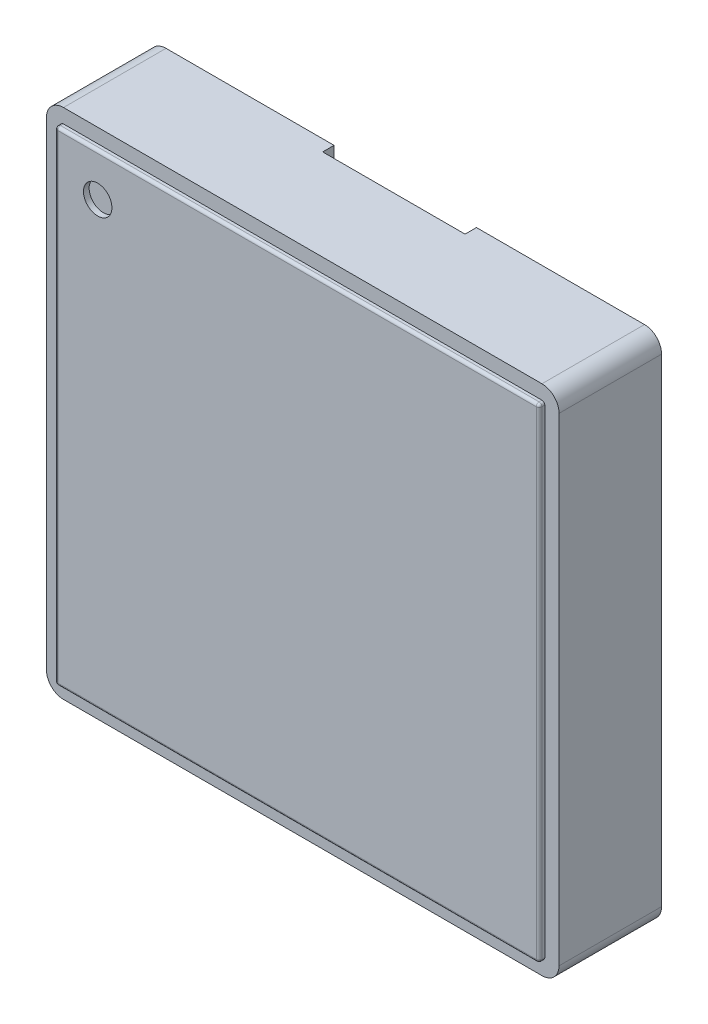
ISO-10303-21;
HEADER;
FILE_DESCRIPTION(('STEP AP214'),'2;1');
FILE_NAME('part.step','',(''),(''),'','','');
FILE_SCHEMA(('AUTOMOTIVE_DESIGN { 1 0 10303 214 1 1 1 1 }'));
ENDSEC;
DATA;
#1=APPLICATION_CONTEXT('core data for automotive mechanical design processes');
#2=APPLICATION_PROTOCOL_DEFINITION('international standard','automotive_design',2000,#1);
#3=PRODUCT_CONTEXT('',#1,'mechanical');
#4=PRODUCT('Part','Part','',(#3));
#5=PRODUCT_RELATED_PRODUCT_CATEGORY('part','',(#4));
#6=PRODUCT_DEFINITION_FORMATION('','',#4);
#7=PRODUCT_DEFINITION_CONTEXT('part definition',#1,'design');
#8=PRODUCT_DEFINITION('design','',#6,#7);
#9=PRODUCT_DEFINITION_SHAPE('','',#8);
#10=(LENGTH_UNIT() NAMED_UNIT(*) SI_UNIT(.MILLI.,.METRE.));
#11=(NAMED_UNIT(*) PLANE_ANGLE_UNIT() SI_UNIT($,.RADIAN.));
#12=(NAMED_UNIT(*) SI_UNIT($,.STERADIAN.) SOLID_ANGLE_UNIT());
#13=UNCERTAINTY_MEASURE_WITH_UNIT(LENGTH_MEASURE(1.E-05),#10,'distance_accuracy_value','');
#14=(GEOMETRIC_REPRESENTATION_CONTEXT(3) GLOBAL_UNCERTAINTY_ASSIGNED_CONTEXT((#13)) GLOBAL_UNIT_ASSIGNED_CONTEXT((#10,
#11,#12)) REPRESENTATION_CONTEXT('',''));
#15=CARTESIAN_POINT('',(0.,0.,0.));
#16=DIRECTION('',(0.,0.,1.));
#17=DIRECTION('',(1.,0.,0.));
#18=AXIS2_PLACEMENT_3D('',#15,#16,#17);
#19=CARTESIAN_POINT('',(-1.25,3.5,0.03));
#20=DIRECTION('',(0.,1.,0.));
#21=DIRECTION('',(0.,0.,1.));
#22=AXIS2_PLACEMENT_3D('',#19,#20,#21);
#23=PLANE('',#22);
#24=DIRECTION('',(0.,0.,1.));
#25=VECTOR('',#24,1.);
#26=CARTESIAN_POINT('',(1.25,3.5,0.03));
#27=LINE('',#26,#25);
#28=CARTESIAN_POINT('',(1.25,3.5,0.03));
#29=VERTEX_POINT('',#28);
#30=CARTESIAN_POINT('',(1.25,3.5,0.23));
#31=VERTEX_POINT('',#30);
#32=EDGE_CURVE('E398',#29,#31,#27,.T.);
#33=ORIENTED_EDGE('',*,*,#32,.F.);
#34=DIRECTION('',(1.,0.,0.));
#35=VECTOR('',#34,1.);
#36=CARTESIAN_POINT('',(0.,3.5,0.03));
#37=LINE('',#36,#35);
#38=CARTESIAN_POINT('',(-1.25,3.5,0.03));
#39=VERTEX_POINT('',#38);
#40=EDGE_CURVE('E388',#29,#39,#37,.F.);
#41=ORIENTED_EDGE('',*,*,#40,.T.);
#42=DIRECTION('',(0.,0.,-1.));
#43=VECTOR('',#42,1.);
#44=CARTESIAN_POINT('',(-1.25,3.5,0.03));
#45=LINE('',#44,#43);
#46=CARTESIAN_POINT('',(-1.25,3.5,0.23));
#47=VERTEX_POINT('',#46);
#48=EDGE_CURVE('E436',#47,#39,#45,.T.);
#49=ORIENTED_EDGE('',*,*,#48,.F.);
#50=DIRECTION('',(1.,0.,0.));
#51=VECTOR('',#50,1.);
#52=CARTESIAN_POINT('',(0.,3.5,0.23));
#53=LINE('',#52,#51);
#54=EDGE_CURVE('E408',#47,#31,#53,.T.);
#55=ORIENTED_EDGE('',*,*,#54,.T.);
#56=EDGE_LOOP('',(#33,#41,#49,#55));
#57=FACE_BOUND('',#56,.T.);
#58=ADVANCED_FACE('F16',(#57),#23,.T.);
#59=CARTESIAN_POINT('',(1.25,-3.5,0.03));
#60=DIRECTION('',(0.,-1.,0.));
#61=DIRECTION('',(0.,0.,-1.));
#62=AXIS2_PLACEMENT_3D('',#59,#60,#61);
#63=PLANE('',#62);
#64=DIRECTION('',(0.,0.,-1.));
#65=VECTOR('',#64,1.);
#66=CARTESIAN_POINT('',(-1.25,-3.5,0.03));
#67=LINE('',#66,#65);
#68=CARTESIAN_POINT('',(-1.25,-3.5,0.03));
#69=VERTEX_POINT('',#68);
#70=CARTESIAN_POINT('',(-1.25,-3.5,0.23));
#71=VERTEX_POINT('',#70);
#72=EDGE_CURVE('E351',#69,#71,#67,.F.);
#73=ORIENTED_EDGE('',*,*,#72,.F.);
#74=DIRECTION('',(1.,0.,0.));
#75=VECTOR('',#74,1.);
#76=CARTESIAN_POINT('',(0.,-3.5,0.03));
#77=LINE('',#76,#75);
#78=CARTESIAN_POINT('',(1.25,-3.5,0.03));
#79=VERTEX_POINT('',#78);
#80=EDGE_CURVE('E339',#69,#79,#77,.T.);
#81=ORIENTED_EDGE('',*,*,#80,.T.);
#82=DIRECTION('',(0.,0.,1.));
#83=VECTOR('',#82,1.);
#84=CARTESIAN_POINT('',(1.25,-3.5,0.03));
#85=LINE('',#84,#83);
#86=CARTESIAN_POINT('',(1.25,-3.5,0.23));
#87=VERTEX_POINT('',#86);
#88=EDGE_CURVE('E362',#87,#79,#85,.F.);
#89=ORIENTED_EDGE('',*,*,#88,.F.);
#90=DIRECTION('',(1.,0.,0.));
#91=VECTOR('',#90,1.);
#92=CARTESIAN_POINT('',(0.,-3.5,0.23));
#93=LINE('',#92,#91);
#94=EDGE_CURVE('E361',#87,#71,#93,.F.);
#95=ORIENTED_EDGE('',*,*,#94,.T.);
#96=EDGE_LOOP('',(#73,#81,#89,#95));
#97=FACE_BOUND('',#96,.T.);
#98=ADVANCED_FACE('F578',(#97),#63,.T.);
#99=CARTESIAN_POINT('',(-1.25,4.5,0.03));
#100=DIRECTION('',(1.,0.,0.));
#101=DIRECTION('',(0.,0.,-1.));
#102=AXIS2_PLACEMENT_3D('',#99,#100,#101);
#103=PLANE('',#102);
#104=ORIENTED_EDGE('',*,*,#48,.T.);
#105=DIRECTION('',(0.,1.,0.));
#106=VECTOR('',#105,1.);
#107=CARTESIAN_POINT('',(-1.25,0.,0.03));
#108=LINE('',#107,#106);
#109=CARTESIAN_POINT('',(-1.25,4.5,0.03));
#110=VERTEX_POINT('',#109);
#111=EDGE_CURVE('E418',#39,#110,#108,.T.);
#112=ORIENTED_EDGE('',*,*,#111,.T.);
#113=DIRECTION('',(0.,0.,-1.));
#114=VECTOR('',#113,1.);
#115=CARTESIAN_POINT('',(-1.25,4.5,0.03));
#116=LINE('',#115,#114);
#117=CARTESIAN_POINT('',(-1.25,4.5,0.23));
#118=VERTEX_POINT('',#117);
#119=EDGE_CURVE('E402',#110,#118,#116,.F.);
#120=ORIENTED_EDGE('',*,*,#119,.T.);
#121=DIRECTION('',(0.,1.,0.));
#122=VECTOR('',#121,1.);
#123=CARTESIAN_POINT('',(-1.25,4.,0.23));
#124=LINE('',#123,#122);
#125=EDGE_CURVE('E405',#118,#47,#124,.F.);
#126=ORIENTED_EDGE('',*,*,#125,.T.);
#127=EDGE_LOOP('',(#104,#112,#120,#126));
#128=FACE_BOUND('',#127,.T.);
#129=ADVANCED_FACE('F575',(#128),#103,.T.);
#130=CARTESIAN_POINT('',(0.,4.,0.23));
#131=DIRECTION('',(0.,0.,1.));
#132=DIRECTION('',(1.,0.,0.));
#133=AXIS2_PLACEMENT_3D('',#130,#131,#132);
#134=PLANE('',#133);
#135=DIRECTION('',(1.,0.,0.));
#136=VECTOR('',#135,1.);
#137=CARTESIAN_POINT('',(4.5,4.5,0.23));
#138=LINE('',#137,#136);
#139=CARTESIAN_POINT('',(1.25,4.5,0.23));
#140=VERTEX_POINT('',#139);
#141=EDGE_CURVE('E393',#118,#140,#138,.T.);
#142=ORIENTED_EDGE('',*,*,#141,.T.);
#143=DIRECTION('',(0.,1.,0.));
#144=VECTOR('',#143,1.);
#145=CARTESIAN_POINT('',(1.25,3.5,0.23));
#146=LINE('',#145,#144);
#147=EDGE_CURVE('E198',#31,#140,#146,.T.);
#148=ORIENTED_EDGE('',*,*,#147,.F.);
#149=ORIENTED_EDGE('',*,*,#54,.F.);
#150=ORIENTED_EDGE('',*,*,#125,.F.);
#151=EDGE_LOOP('',(#142,#148,#149,#150));
#152=FACE_BOUND('',#151,.T.);
#153=ADVANCED_FACE('F571',(#152),#134,.F.);
#154=CARTESIAN_POINT('',(1.25,3.5,0.03));
#155=DIRECTION('',(-1.,0.,0.));
#156=DIRECTION('',(0.,0.,1.));
#157=AXIS2_PLACEMENT_3D('',#154,#155,#156);
#158=PLANE('',#157);
#159=DIRECTION('',(0.,0.,-1.));
#160=VECTOR('',#159,1.);
#161=CARTESIAN_POINT('',(1.25,4.5,0.03));
#162=LINE('',#161,#160);
#163=CARTESIAN_POINT('',(1.25,4.5,0.03));
#164=VERTEX_POINT('',#163);
#165=EDGE_CURVE('E382',#140,#164,#162,.T.);
#166=ORIENTED_EDGE('',*,*,#165,.T.);
#167=DIRECTION('',(0.,1.,0.));
#168=VECTOR('',#167,1.);
#169=CARTESIAN_POINT('',(1.25,0.,0.03));
#170=LINE('',#169,#168);
#171=EDGE_CURVE('E385',#164,#29,#170,.F.);
#172=ORIENTED_EDGE('',*,*,#171,.T.);
#173=ORIENTED_EDGE('',*,*,#32,.T.);
#174=ORIENTED_EDGE('',*,*,#147,.T.);
#175=EDGE_LOOP('',(#166,#172,#173,#174));
#176=FACE_BOUND('',#175,.T.);
#177=ADVANCED_FACE('F568',(#176),#158,.T.);
#178=CARTESIAN_POINT('',(4.2,4.2,0.03));
#179=DIRECTION('',(0.,0.,1.));
#180=DIRECTION('',(1.,0.,0.));
#181=AXIS2_PLACEMENT_3D('',#178,#179,#180);
#182=CYLINDRICAL_SURFACE('',#181,0.3);
#183=CARTESIAN_POINT('',(4.2,4.2,1.83));
#184=DIRECTION('',(0.,0.,1.));
#185=DIRECTION('',(1.,0.,0.));
#186=AXIS2_PLACEMENT_3D('',#183,#184,#185);
#187=CIRCLE('',#186,0.3);
#188=CARTESIAN_POINT('',(4.2,4.5,1.83));
#189=VERTEX_POINT('',#188);
#190=CARTESIAN_POINT('',(4.5,4.2,1.83));
#191=VERTEX_POINT('',#190);
#192=EDGE_CURVE('E19',#189,#191,#187,.F.);
#193=ORIENTED_EDGE('',*,*,#192,.T.);
#194=DIRECTION('',(0.,0.,1.));
#195=VECTOR('',#194,1.);
#196=CARTESIAN_POINT('',(4.5,4.2,0.03));
#197=LINE('',#196,#195);
#198=CARTESIAN_POINT('',(4.5,4.2,0.03));
#199=VERTEX_POINT('',#198);
#200=EDGE_CURVE('E192',#191,#199,#197,.F.);
#201=ORIENTED_EDGE('',*,*,#200,.T.);
#202=CARTESIAN_POINT('',(4.2,4.2,0.03));
#203=DIRECTION('',(0.,0.,1.));
#204=DIRECTION('',(1.,0.,0.));
#205=AXIS2_PLACEMENT_3D('',#202,#203,#204);
#206=CIRCLE('',#205,0.3);
#207=CARTESIAN_POINT('',(4.2,4.5,0.03));
#208=VERTEX_POINT('',#207);
#209=EDGE_CURVE('E389',#199,#208,#206,.T.);
#210=ORIENTED_EDGE('',*,*,#209,.T.);
#211=DIRECTION('',(0.,0.,-1.));
#212=VECTOR('',#211,1.);
#213=CARTESIAN_POINT('',(4.2,4.5,0.03));
#214=LINE('',#213,#212);
#215=EDGE_CURVE('E195',#208,#189,#214,.F.);
#216=ORIENTED_EDGE('',*,*,#215,.T.);
#217=EDGE_LOOP('',(#193,#201,#210,#216));
#218=FACE_BOUND('',#217,.T.);
#219=ADVANCED_FACE('F191',(#218),#182,.T.);
#220=CARTESIAN_POINT('',(-4.2,4.2,0.03));
#221=DIRECTION('',(0.,0.,1.));
#222=DIRECTION('',(1.,0.,0.));
#223=AXIS2_PLACEMENT_3D('',#220,#221,#222);
#224=CYLINDRICAL_SURFACE('',#223,0.3);
#225=DIRECTION('',(0.,0.,-1.));
#226=VECTOR('',#225,1.);
#227=CARTESIAN_POINT('',(-4.2,4.5,0.03));
#228=LINE('',#227,#226);
#229=CARTESIAN_POINT('',(-4.2,4.5,1.83));
#230=VERTEX_POINT('',#229);
#231=CARTESIAN_POINT('',(-4.2,4.5,0.03));
#232=VERTEX_POINT('',#231);
#233=EDGE_CURVE('E327',#230,#232,#228,.T.);
#234=ORIENTED_EDGE('',*,*,#233,.T.);
#235=CARTESIAN_POINT('',(-4.2,4.2,0.03));
#236=DIRECTION('',(0.,0.,1.));
#237=DIRECTION('',(1.,0.,0.));
#238=AXIS2_PLACEMENT_3D('',#235,#236,#237);
#239=CIRCLE('',#238,0.3);
#240=CARTESIAN_POINT('',(-4.5,4.2,0.03));
#241=VERTEX_POINT('',#240);
#242=EDGE_CURVE('E340',#232,#241,#239,.T.);
#243=ORIENTED_EDGE('',*,*,#242,.T.);
#244=DIRECTION('',(0.,0.,-1.));
#245=VECTOR('',#244,1.);
#246=CARTESIAN_POINT('',(-4.5,4.2,0.03));
#247=LINE('',#246,#245);
#248=CARTESIAN_POINT('',(-4.5,4.2,1.83));
#249=VERTEX_POINT('',#248);
#250=EDGE_CURVE('E319',#241,#249,#247,.F.);
#251=ORIENTED_EDGE('',*,*,#250,.T.);
#252=CARTESIAN_POINT('',(-4.2,4.2,1.83));
#253=DIRECTION('',(0.,0.,1.));
#254=DIRECTION('',(1.,0.,0.));
#255=AXIS2_PLACEMENT_3D('',#252,#253,#254);
#256=CIRCLE('',#255,0.3);
#257=EDGE_CURVE('E197',#249,#230,#256,.F.);
#258=ORIENTED_EDGE('',*,*,#257,.T.);
#259=EDGE_LOOP('',(#234,#243,#251,#258));
#260=FACE_BOUND('',#259,.T.);
#261=ADVANCED_FACE('F474',(#260),#224,.T.);
#262=CARTESIAN_POINT('',(4.2,-4.2,0.03));
#263=DIRECTION('',(0.,0.,1.));
#264=DIRECTION('',(1.,0.,0.));
#265=AXIS2_PLACEMENT_3D('',#262,#263,#264);
#266=CYLINDRICAL_SURFACE('',#265,0.3);
#267=CARTESIAN_POINT('',(4.2,-4.2,1.83));
#268=DIRECTION('',(0.,0.,1.));
#269=DIRECTION('',(1.,0.,0.));
#270=AXIS2_PLACEMENT_3D('',#267,#268,#269);
#271=CIRCLE('',#270,0.3);
#272=CARTESIAN_POINT('',(4.5,-4.2,1.83));
#273=VERTEX_POINT('',#272);
#274=CARTESIAN_POINT('',(4.2,-4.5,1.83));
#275=VERTEX_POINT('',#274);
#276=EDGE_CURVE('E211',#273,#275,#271,.F.);
#277=ORIENTED_EDGE('',*,*,#276,.T.);
#278=DIRECTION('',(0.,0.,1.));
#279=VECTOR('',#278,1.);
#280=CARTESIAN_POINT('',(4.2,-4.5,0.03));
#281=LINE('',#280,#279);
#282=CARTESIAN_POINT('',(4.2,-4.5,0.03));
#283=VERTEX_POINT('',#282);
#284=EDGE_CURVE('E315',#275,#283,#281,.F.);
#285=ORIENTED_EDGE('',*,*,#284,.T.);
#286=CARTESIAN_POINT('',(4.2,-4.2,0.03));
#287=DIRECTION('',(0.,0.,1.));
#288=DIRECTION('',(1.,0.,0.));
#289=AXIS2_PLACEMENT_3D('',#286,#287,#288);
#290=CIRCLE('',#289,0.3);
#291=CARTESIAN_POINT('',(4.5,-4.2,0.03));
#292=VERTEX_POINT('',#291);
#293=EDGE_CURVE('E350',#283,#292,#290,.T.);
#294=ORIENTED_EDGE('',*,*,#293,.T.);
#295=DIRECTION('',(0.,0.,1.));
#296=VECTOR('',#295,1.);
#297=CARTESIAN_POINT('',(4.5,-4.2,0.03));
#298=LINE('',#297,#296);
#299=EDGE_CURVE('E206',#292,#273,#298,.T.);
#300=ORIENTED_EDGE('',*,*,#299,.T.);
#301=EDGE_LOOP('',(#277,#285,#294,#300));
#302=FACE_BOUND('',#301,.T.);
#303=ADVANCED_FACE('F559',(#302),#266,.T.);
#304=CARTESIAN_POINT('',(1.25,-4.5,0.03));
#305=DIRECTION('',(-1.,0.,0.));
#306=DIRECTION('',(0.,0.,1.));
#307=AXIS2_PLACEMENT_3D('',#304,#305,#306);
#308=PLANE('',#307);
#309=ORIENTED_EDGE('',*,*,#88,.T.);
#310=DIRECTION('',(0.,1.,0.));
#311=VECTOR('',#310,1.);
#312=CARTESIAN_POINT('',(1.25,0.,0.03));
#313=LINE('',#312,#311);
#314=CARTESIAN_POINT('',(1.25,-4.5,0.03));
#315=VERTEX_POINT('',#314);
#316=EDGE_CURVE('E372',#79,#315,#313,.F.);
#317=ORIENTED_EDGE('',*,*,#316,.T.);
#318=DIRECTION('',(0.,0.,1.));
#319=VECTOR('',#318,1.);
#320=CARTESIAN_POINT('',(1.25,-4.5,0.03));
#321=LINE('',#320,#319);
#322=CARTESIAN_POINT('',(1.25,-4.5,0.23));
#323=VERTEX_POINT('',#322);
#324=EDGE_CURVE('E355',#315,#323,#321,.T.);
#325=ORIENTED_EDGE('',*,*,#324,.T.);
#326=DIRECTION('',(0.,1.,0.));
#327=VECTOR('',#326,1.);
#328=CARTESIAN_POINT('',(1.25,-4.,0.23));
#329=LINE('',#328,#327);
#330=EDGE_CURVE('E358',#323,#87,#329,.T.);
#331=ORIENTED_EDGE('',*,*,#330,.T.);
#332=EDGE_LOOP('',(#309,#317,#325,#331));
#333=FACE_BOUND('',#332,.T.);
#334=ADVANCED_FACE('F555',(#333),#308,.T.);
#335=CARTESIAN_POINT('',(0.,-4.,0.23));
#336=DIRECTION('',(0.,0.,1.));
#337=DIRECTION('',(1.,0.,0.));
#338=AXIS2_PLACEMENT_3D('',#335,#336,#337);
#339=PLANE('',#338);
#340=ORIENTED_EDGE('',*,*,#94,.F.);
#341=ORIENTED_EDGE('',*,*,#330,.F.);
#342=DIRECTION('',(1.,0.,0.));
#343=VECTOR('',#342,1.);
#344=CARTESIAN_POINT('',(-4.5,-4.5,0.23));
#345=LINE('',#344,#343);
#346=CARTESIAN_POINT('',(-1.25,-4.5,0.23));
#347=VERTEX_POINT('',#346);
#348=EDGE_CURVE('E344',#323,#347,#345,.F.);
#349=ORIENTED_EDGE('',*,*,#348,.T.);
#350=DIRECTION('',(0.,1.,0.));
#351=VECTOR('',#350,1.);
#352=CARTESIAN_POINT('',(-1.25,-3.5,0.23));
#353=LINE('',#352,#351);
#354=EDGE_CURVE('E347',#71,#347,#353,.F.);
#355=ORIENTED_EDGE('',*,*,#354,.F.);
#356=EDGE_LOOP('',(#340,#341,#349,#355));
#357=FACE_BOUND('',#356,.T.);
#358=ADVANCED_FACE('F551',(#357),#339,.F.);
#359=CARTESIAN_POINT('',(-1.25,-3.5,0.03));
#360=DIRECTION('',(1.,0.,0.));
#361=DIRECTION('',(0.,0.,-1.));
#362=AXIS2_PLACEMENT_3D('',#359,#360,#361);
#363=PLANE('',#362);
#364=DIRECTION('',(0.,0.,1.));
#365=VECTOR('',#364,1.);
#366=CARTESIAN_POINT('',(-1.25,-4.5,0.03));
#367=LINE('',#366,#365);
#368=CARTESIAN_POINT('',(-1.25,-4.5,0.03));
#369=VERTEX_POINT('',#368);
#370=EDGE_CURVE('E333',#347,#369,#367,.F.);
#371=ORIENTED_EDGE('',*,*,#370,.T.);
#372=DIRECTION('',(0.,1.,0.));
#373=VECTOR('',#372,1.);
#374=CARTESIAN_POINT('',(-1.25,0.,0.03));
#375=LINE('',#374,#373);
#376=EDGE_CURVE('E336',#369,#69,#375,.T.);
#377=ORIENTED_EDGE('',*,*,#376,.T.);
#378=ORIENTED_EDGE('',*,*,#72,.T.);
#379=ORIENTED_EDGE('',*,*,#354,.T.);
#380=EDGE_LOOP('',(#371,#377,#378,#379));
#381=FACE_BOUND('',#380,.T.);
#382=ADVANCED_FACE('F548',(#381),#363,.T.);
#383=CARTESIAN_POINT('',(0.,0.,0.03));
#384=DIRECTION('',(0.,0.,1.));
#385=DIRECTION('',(1.,0.,0.));
#386=AXIS2_PLACEMENT_3D('',#383,#384,#385);
#387=PLANE('',#386);
#388=ORIENTED_EDGE('',*,*,#316,.F.);
#389=ORIENTED_EDGE('',*,*,#80,.F.);
#390=ORIENTED_EDGE('',*,*,#376,.F.);
#391=DIRECTION('',(1.,0.,0.));
#392=VECTOR('',#391,1.);
#393=CARTESIAN_POINT('',(-4.5,-4.5,0.03));
#394=LINE('',#393,#392);
#395=CARTESIAN_POINT('',(-4.2,-4.5,0.03));
#396=VERTEX_POINT('',#395);
#397=EDGE_CURVE('E314',#369,#396,#394,.F.);
#398=ORIENTED_EDGE('',*,*,#397,.T.);
#399=CARTESIAN_POINT('',(-4.2,-4.2,0.03));
#400=DIRECTION('',(0.,0.,1.));
#401=DIRECTION('',(1.,0.,0.));
#402=AXIS2_PLACEMENT_3D('',#399,#400,#401);
#403=CIRCLE('',#402,0.3);
#404=CARTESIAN_POINT('',(-4.5,-4.2,0.03));
#405=VERTEX_POINT('',#404);
#406=EDGE_CURVE('E330',#405,#396,#403,.T.);
#407=ORIENTED_EDGE('',*,*,#406,.F.);
#408=DIRECTION('',(0.,1.,0.));
#409=VECTOR('',#408,1.);
#410=CARTESIAN_POINT('',(-4.5,4.5,0.03));
#411=LINE('',#410,#409);
#412=EDGE_CURVE('E318',#405,#241,#411,.T.);
#413=ORIENTED_EDGE('',*,*,#412,.T.);
#414=ORIENTED_EDGE('',*,*,#242,.F.);
#415=DIRECTION('',(1.,0.,0.));
#416=VECTOR('',#415,1.);
#417=CARTESIAN_POINT('',(4.5,4.5,0.03));
#418=LINE('',#417,#416);
#419=EDGE_CURVE('E329',#232,#110,#418,.T.);
#420=ORIENTED_EDGE('',*,*,#419,.T.);
#421=ORIENTED_EDGE('',*,*,#111,.F.);
#422=ORIENTED_EDGE('',*,*,#40,.F.);
#423=ORIENTED_EDGE('',*,*,#171,.F.);
#424=DIRECTION('',(1.,0.,0.));
#425=VECTOR('',#424,1.);
#426=CARTESIAN_POINT('',(4.5,4.5,0.03));
#427=LINE('',#426,#425);
#428=EDGE_CURVE('E326',#164,#208,#427,.T.);
#429=ORIENTED_EDGE('',*,*,#428,.T.);
#430=ORIENTED_EDGE('',*,*,#209,.F.);
#431=DIRECTION('',(0.,1.,0.));
#432=VECTOR('',#431,1.);
#433=CARTESIAN_POINT('',(4.5,-4.5,0.03));
#434=LINE('',#433,#432);
#435=EDGE_CURVE('E205',#199,#292,#434,.F.);
#436=ORIENTED_EDGE('',*,*,#435,.T.);
#437=ORIENTED_EDGE('',*,*,#293,.F.);
#438=DIRECTION('',(1.,0.,0.));
#439=VECTOR('',#438,1.);
#440=CARTESIAN_POINT('',(-4.5,-4.5,0.03));
#441=LINE('',#440,#439);
#442=EDGE_CURVE('E317',#283,#315,#441,.F.);
#443=ORIENTED_EDGE('',*,*,#442,.T.);
#444=EDGE_LOOP('',(#388,#389,#390,#398,#407,#413,#414,#420,#421,#422,#423,#429,#430,#436,#437,#443));
#445=FACE_BOUND('',#444,.T.);
#446=ADVANCED_FACE('F488',(#445),#387,.F.);
#447=CARTESIAN_POINT('',(-4.2,-4.2,0.03));
#448=DIRECTION('',(0.,0.,1.));
#449=DIRECTION('',(1.,0.,0.));
#450=AXIS2_PLACEMENT_3D('',#447,#448,#449);
#451=CYLINDRICAL_SURFACE('',#450,0.3);
#452=DIRECTION('',(0.,0.,-1.));
#453=VECTOR('',#452,1.);
#454=CARTESIAN_POINT('',(-4.5,-4.2,0.03));
#455=LINE('',#454,#453);
#456=CARTESIAN_POINT('',(-4.5,-4.2,1.83));
#457=VERTEX_POINT('',#456);
#458=EDGE_CURVE('E322',#457,#405,#455,.T.);
#459=ORIENTED_EDGE('',*,*,#458,.T.);
#460=ORIENTED_EDGE('',*,*,#406,.T.);
#461=DIRECTION('',(0.,0.,1.));
#462=VECTOR('',#461,1.);
#463=CARTESIAN_POINT('',(-4.2,-4.5,0.03));
#464=LINE('',#463,#462);
#465=CARTESIAN_POINT('',(-4.2,-4.5,1.83));
#466=VERTEX_POINT('',#465);
#467=EDGE_CURVE('E311',#396,#466,#464,.T.);
#468=ORIENTED_EDGE('',*,*,#467,.T.);
#469=CARTESIAN_POINT('',(-4.2,-4.2,1.83));
#470=DIRECTION('',(0.,0.,1.));
#471=DIRECTION('',(1.,0.,0.));
#472=AXIS2_PLACEMENT_3D('',#469,#470,#471);
#473=CIRCLE('',#472,0.3);
#474=EDGE_CURVE('E374',#466,#457,#473,.F.);
#475=ORIENTED_EDGE('',*,*,#474,.T.);
#476=EDGE_LOOP('',(#459,#460,#468,#475));
#477=FACE_BOUND('',#476,.T.);
#478=ADVANCED_FACE('F542',(#477),#451,.T.);
#479=CARTESIAN_POINT('',(4.5,-4.5,0.03));
#480=DIRECTION('',(-1.,0.,0.));
#481=DIRECTION('',(0.,0.,1.));
#482=AXIS2_PLACEMENT_3D('',#479,#480,#481);
#483=PLANE('',#482);
#484=ORIENTED_EDGE('',*,*,#299,.F.);
#485=ORIENTED_EDGE('',*,*,#435,.F.);
#486=ORIENTED_EDGE('',*,*,#200,.F.);
#487=DIRECTION('',(0.,1.,0.));
#488=VECTOR('',#487,1.);
#489=CARTESIAN_POINT('',(4.5,0.,1.83));
#490=LINE('',#489,#488);
#491=EDGE_CURVE('E204',#273,#191,#490,.T.);
#492=ORIENTED_EDGE('',*,*,#491,.F.);
#493=EDGE_LOOP('',(#484,#485,#486,#492));
#494=FACE_BOUND('',#493,.T.);
#495=ADVANCED_FACE('F203',(#494),#483,.F.);
#496=CARTESIAN_POINT('',(4.5,4.5,0.03));
#497=DIRECTION('',(0.,-1.,0.));
#498=DIRECTION('',(0.,0.,-1.));
#499=AXIS2_PLACEMENT_3D('',#496,#497,#498);
#500=PLANE('',#499);
#501=ORIENTED_EDGE('',*,*,#428,.F.);
#502=ORIENTED_EDGE('',*,*,#165,.F.);
#503=ORIENTED_EDGE('',*,*,#141,.F.);
#504=ORIENTED_EDGE('',*,*,#119,.F.);
#505=ORIENTED_EDGE('',*,*,#419,.F.);
#506=ORIENTED_EDGE('',*,*,#233,.F.);
#507=DIRECTION('',(1.,0.,0.));
#508=VECTOR('',#507,1.);
#509=CARTESIAN_POINT('',(0.,4.5,1.83));
#510=LINE('',#509,#508);
#511=EDGE_CURVE('E213',#189,#230,#510,.F.);
#512=ORIENTED_EDGE('',*,*,#511,.F.);
#513=ORIENTED_EDGE('',*,*,#215,.F.);
#514=EDGE_LOOP('',(#501,#502,#503,#504,#505,#506,#512,#513));
#515=FACE_BOUND('',#514,.T.);
#516=ADVANCED_FACE('F482',(#515),#500,.F.);
#517=CARTESIAN_POINT('',(-4.5,4.5,0.03));
#518=DIRECTION('',(1.,0.,0.));
#519=DIRECTION('',(0.,0.,-1.));
#520=AXIS2_PLACEMENT_3D('',#517,#518,#519);
#521=PLANE('',#520);
#522=ORIENTED_EDGE('',*,*,#250,.F.);
#523=ORIENTED_EDGE('',*,*,#412,.F.);
#524=ORIENTED_EDGE('',*,*,#458,.F.);
#525=DIRECTION('',(0.,1.,0.));
#526=VECTOR('',#525,1.);
#527=CARTESIAN_POINT('',(-4.5,0.,1.83));
#528=LINE('',#527,#526);
#529=EDGE_CURVE('E216',#249,#457,#528,.F.);
#530=ORIENTED_EDGE('',*,*,#529,.F.);
#531=EDGE_LOOP('',(#522,#523,#524,#530));
#532=FACE_BOUND('',#531,.T.);
#533=ADVANCED_FACE('F492',(#532),#521,.F.);
#534=CARTESIAN_POINT('',(-4.5,-4.5,0.03));
#535=DIRECTION('',(0.,1.,0.));
#536=DIRECTION('',(0.,0.,1.));
#537=AXIS2_PLACEMENT_3D('',#534,#535,#536);
#538=PLANE('',#537);
#539=ORIENTED_EDGE('',*,*,#397,.F.);
#540=ORIENTED_EDGE('',*,*,#370,.F.);
#541=ORIENTED_EDGE('',*,*,#348,.F.);
#542=ORIENTED_EDGE('',*,*,#324,.F.);
#543=ORIENTED_EDGE('',*,*,#442,.F.);
#544=ORIENTED_EDGE('',*,*,#284,.F.);
#545=DIRECTION('',(1.,0.,0.));
#546=VECTOR('',#545,1.);
#547=CARTESIAN_POINT('',(0.,-4.5,1.83));
#548=LINE('',#547,#546);
#549=EDGE_CURVE('E461',#466,#275,#548,.T.);
#550=ORIENTED_EDGE('',*,*,#549,.F.);
#551=ORIENTED_EDGE('',*,*,#467,.F.);
#552=EDGE_LOOP('',(#539,#540,#541,#542,#543,#544,#550,#551));
#553=FACE_BOUND('',#552,.T.);
#554=ADVANCED_FACE('F531',(#553),#538,.F.);
#555=CARTESIAN_POINT('',(4.2,-4.2,1.83));
#556=DIRECTION('',(0.,0.,1.));
#557=DIRECTION('',(1.,0.,0.));
#558=AXIS2_PLACEMENT_3D('',#555,#556,#557);
#559=CYLINDRICAL_SURFACE('',#558,0.05);
#560=CARTESIAN_POINT('',(4.2,-4.2,1.88));
#561=DIRECTION('',(-1.53321187377335E-11,0.,1.));
#562=DIRECTION('',(0.,-1.,0.));
#563=AXIS2_PLACEMENT_3D('',#560,#561,#562);
#564=CIRCLE('',#563,0.05);
#565=CARTESIAN_POINT('',(4.2,-4.25,1.88));
#566=VERTEX_POINT('',#565);
#567=CARTESIAN_POINT('',(4.25,-4.2,1.88000000000019));
#568=VERTEX_POINT('',#567);
#569=EDGE_CURVE('E280',#566,#568,#564,.T.);
#570=ORIENTED_EDGE('',*,*,#569,.F.);
#571=DIRECTION('',(0.,0.,-1.));
#572=VECTOR('',#571,1.);
#573=CARTESIAN_POINT('',(4.2,-4.25,1.83));
#574=LINE('',#573,#572);
#575=CARTESIAN_POINT('',(4.2,-4.25,1.83));
#576=VERTEX_POINT('',#575);
#577=EDGE_CURVE('E292',#576,#566,#574,.F.);
#578=ORIENTED_EDGE('',*,*,#577,.F.);
#579=CARTESIAN_POINT('',(4.2,-4.2,1.83));
#580=DIRECTION('',(0.,0.,1.));
#581=DIRECTION('',(1.,0.,0.));
#582=AXIS2_PLACEMENT_3D('',#579,#580,#581);
#583=CIRCLE('',#582,0.05);
#584=CARTESIAN_POINT('',(4.25,-4.2,1.83));
#585=VERTEX_POINT('',#584);
#586=EDGE_CURVE('E214',#585,#576,#583,.F.);
#587=ORIENTED_EDGE('',*,*,#586,.F.);
#588=DIRECTION('',(0.,0.,-1.));
#589=VECTOR('',#588,1.);
#590=CARTESIAN_POINT('',(4.25,-4.2,1.83));
#591=LINE('',#590,#589);
#592=EDGE_CURVE('E246',#568,#585,#591,.T.);
#593=ORIENTED_EDGE('',*,*,#592,.F.);
#594=EDGE_LOOP('',(#570,#578,#587,#593));
#595=FACE_BOUND('',#594,.T.);
#596=ADVANCED_FACE('F527',(#595),#559,.T.);
#597=CARTESIAN_POINT('',(4.2,4.2,1.88));
#598=DIRECTION('',(0.,0.,-1.));
#599=DIRECTION('',(-1.,0.,0.));
#600=AXIS2_PLACEMENT_3D('',#597,#598,#599);
#601=CYLINDRICAL_SURFACE('',#600,0.05);
#602=CARTESIAN_POINT('',(4.2,4.2,1.83));
#603=DIRECTION('',(0.,0.,-1.));
#604=DIRECTION('',(-1.,0.,0.));
#605=AXIS2_PLACEMENT_3D('',#602,#603,#604);
#606=CIRCLE('',#605,0.05);
#607=CARTESIAN_POINT('',(4.2,4.25,1.83));
#608=VERTEX_POINT('',#607);
#609=CARTESIAN_POINT('',(4.25,4.2,1.83));
#610=VERTEX_POINT('',#609);
#611=EDGE_CURVE('E218',#608,#610,#606,.T.);
#612=ORIENTED_EDGE('',*,*,#611,.F.);
#613=DIRECTION('',(0.,0.,1.));
#614=VECTOR('',#613,1.);
#615=CARTESIAN_POINT('',(4.2,4.25,1.83));
#616=LINE('',#615,#614);
#617=CARTESIAN_POINT('',(4.2,4.25,1.88));
#618=VERTEX_POINT('',#617);
#619=EDGE_CURVE('E233',#618,#608,#616,.F.);
#620=ORIENTED_EDGE('',*,*,#619,.F.);
#621=CARTESIAN_POINT('',(4.2,4.2,1.88));
#622=DIRECTION('',(0.,0.,1.));
#623=DIRECTION('',(0.,-1.,0.));
#624=AXIS2_PLACEMENT_3D('',#621,#622,#623);
#625=CIRCLE('',#624,0.0499999999999997);
#626=CARTESIAN_POINT('',(4.25,4.20000000000038,1.88));
#627=VERTEX_POINT('',#626);
#628=EDGE_CURVE('E237',#627,#618,#625,.T.);
#629=ORIENTED_EDGE('',*,*,#628,.F.);
#630=DIRECTION('',(0.,0.,-1.));
#631=VECTOR('',#630,1.);
#632=CARTESIAN_POINT('',(4.25,4.2,1.83));
#633=LINE('',#632,#631);
#634=EDGE_CURVE('E261',#610,#627,#633,.F.);
#635=ORIENTED_EDGE('',*,*,#634,.F.);
#636=EDGE_LOOP('',(#612,#620,#629,#635));
#637=FACE_BOUND('',#636,.T.);
#638=ADVANCED_FACE('F524',(#637),#601,.T.);
#639=CARTESIAN_POINT('',(0.,0.,1.83));
#640=DIRECTION('',(0.,0.,1.));
#641=DIRECTION('',(1.,0.,0.));
#642=AXIS2_PLACEMENT_3D('',#639,#640,#641);
#643=PLANE('',#642);
#644=ORIENTED_EDGE('',*,*,#549,.T.);
#645=ORIENTED_EDGE('',*,*,#276,.F.);
#646=ORIENTED_EDGE('',*,*,#491,.T.);
#647=ORIENTED_EDGE('',*,*,#192,.F.);
#648=ORIENTED_EDGE('',*,*,#511,.T.);
#649=ORIENTED_EDGE('',*,*,#257,.F.);
#650=ORIENTED_EDGE('',*,*,#529,.T.);
#651=ORIENTED_EDGE('',*,*,#474,.F.);
#652=EDGE_LOOP('',(#644,#645,#646,#647,#648,#649,#650,#651));
#653=FACE_BOUND('',#652,.T.);
#654=DIRECTION('',(0.,1.,0.));
#655=VECTOR('',#654,1.);
#656=CARTESIAN_POINT('',(-4.25,-9.,1.83));
#657=LINE('',#656,#655);
#658=CARTESIAN_POINT('',(-4.25,4.2,1.83));
#659=VERTEX_POINT('',#658);
#660=CARTESIAN_POINT('',(-4.25,-4.2,1.83));
#661=VERTEX_POINT('',#660);
#662=EDGE_CURVE('E222',#659,#661,#657,.F.);
#663=ORIENTED_EDGE('',*,*,#662,.F.);
#664=CARTESIAN_POINT('',(-4.2,4.2,1.83));
#665=DIRECTION('',(0.,0.,1.));
#666=DIRECTION('',(1.,0.,0.));
#667=AXIS2_PLACEMENT_3D('',#664,#665,#666);
#668=CIRCLE('',#667,0.05);
#669=CARTESIAN_POINT('',(-4.2,4.25,1.83));
#670=VERTEX_POINT('',#669);
#671=EDGE_CURVE('E287',#670,#659,#668,.T.);
#672=ORIENTED_EDGE('',*,*,#671,.F.);
#673=DIRECTION('',(1.,0.,0.));
#674=VECTOR('',#673,1.);
#675=CARTESIAN_POINT('',(-9.,4.25,1.83));
#676=LINE('',#675,#674);
#677=EDGE_CURVE('E236',#608,#670,#676,.F.);
#678=ORIENTED_EDGE('',*,*,#677,.F.);
#679=ORIENTED_EDGE('',*,*,#611,.T.);
#680=DIRECTION('',(0.,1.,0.));
#681=VECTOR('',#680,1.);
#682=CARTESIAN_POINT('',(4.25,9.,1.83));
#683=LINE('',#682,#681);
#684=EDGE_CURVE('E264',#585,#610,#683,.T.);
#685=ORIENTED_EDGE('',*,*,#684,.F.);
#686=ORIENTED_EDGE('',*,*,#586,.T.);
#687=DIRECTION('',(1.,0.,0.));
#688=VECTOR('',#687,1.);
#689=CARTESIAN_POINT('',(9.,-4.25,1.83));
#690=LINE('',#689,#688);
#691=CARTESIAN_POINT('',(-4.2,-4.25,1.83));
#692=VERTEX_POINT('',#691);
#693=EDGE_CURVE('E286',#692,#576,#690,.T.);
#694=ORIENTED_EDGE('',*,*,#693,.F.);
#695=CARTESIAN_POINT('',(-4.2,-4.2,1.83));
#696=DIRECTION('',(0.,0.,-1.));
#697=DIRECTION('',(-1.,0.,0.));
#698=AXIS2_PLACEMENT_3D('',#695,#696,#697);
#699=CIRCLE('',#698,0.05);
#700=EDGE_CURVE('E460',#661,#692,#699,.F.);
#701=ORIENTED_EDGE('',*,*,#700,.F.);
#702=EDGE_LOOP('',(#663,#672,#678,#679,#685,#686,#694,#701));
#703=FACE_BOUND('',#702,.T.);
#704=ADVANCED_FACE('F209',(#653,#703),#643,.T.);
#705=CARTESIAN_POINT('',(-4.2,-4.2,1.88));
#706=DIRECTION('',(0.,0.,-1.));
#707=DIRECTION('',(-1.,0.,0.));
#708=AXIS2_PLACEMENT_3D('',#705,#706,#707);
#709=CYLINDRICAL_SURFACE('',#708,0.05);
#710=DIRECTION('',(0.,0.,-1.));
#711=VECTOR('',#710,1.);
#712=CARTESIAN_POINT('',(-4.2,-4.25,1.83));
#713=LINE('',#712,#711);
#714=CARTESIAN_POINT('',(-4.2,-4.25,1.88));
#715=VERTEX_POINT('',#714);
#716=EDGE_CURVE('E283',#715,#692,#713,.T.);
#717=ORIENTED_EDGE('',*,*,#716,.F.);
#718=CARTESIAN_POINT('',(-4.2,-4.2,1.88));
#719=DIRECTION('',(0.,0.,1.));
#720=DIRECTION('',(0.,-1.,0.));
#721=AXIS2_PLACEMENT_3D('',#718,#719,#720);
#722=CIRCLE('',#721,0.0499999999999997);
#723=CARTESIAN_POINT('',(-4.25,-4.2,1.88));
#724=VERTEX_POINT('',#723);
#725=EDGE_CURVE('E230',#724,#715,#722,.T.);
#726=ORIENTED_EDGE('',*,*,#725,.F.);
#727=DIRECTION('',(0.,0.,1.));
#728=VECTOR('',#727,1.);
#729=CARTESIAN_POINT('',(-4.25,-4.2,1.83));
#730=LINE('',#729,#728);
#731=EDGE_CURVE('E225',#661,#724,#730,.T.);
#732=ORIENTED_EDGE('',*,*,#731,.F.);
#733=ORIENTED_EDGE('',*,*,#700,.T.);
#734=EDGE_LOOP('',(#717,#726,#732,#733));
#735=FACE_BOUND('',#734,.T.);
#736=ADVANCED_FACE('F517',(#735),#709,.T.);
#737=CARTESIAN_POINT('',(-4.2,4.2,1.83));
#738=DIRECTION('',(0.,0.,1.));
#739=DIRECTION('',(1.,0.,0.));
#740=AXIS2_PLACEMENT_3D('',#737,#738,#739);
#741=CYLINDRICAL_SURFACE('',#740,0.05);
#742=DIRECTION('',(0.,0.,1.));
#743=VECTOR('',#742,1.);
#744=CARTESIAN_POINT('',(-4.2,4.25,1.83));
#745=LINE('',#744,#743);
#746=CARTESIAN_POINT('',(-4.2,4.25,1.88));
#747=VERTEX_POINT('',#746);
#748=EDGE_CURVE('E226',#670,#747,#745,.T.);
#749=ORIENTED_EDGE('',*,*,#748,.F.);
#750=ORIENTED_EDGE('',*,*,#671,.T.);
#751=DIRECTION('',(0.,0.,1.));
#752=VECTOR('',#751,1.);
#753=CARTESIAN_POINT('',(-4.25,4.2,1.83));
#754=LINE('',#753,#752);
#755=CARTESIAN_POINT('',(-4.25,4.2,1.8800000000001));
#756=VERTEX_POINT('',#755);
#757=EDGE_CURVE('E227',#756,#659,#754,.F.);
#758=ORIENTED_EDGE('',*,*,#757,.F.);
#759=CARTESIAN_POINT('',(-4.2,4.2,1.88));
#760=DIRECTION('',(1.53315521838437E-11,0.,1.));
#761=DIRECTION('',(0.,1.,0.));
#762=AXIS2_PLACEMENT_3D('',#759,#760,#761);
#763=CIRCLE('',#762,0.05);
#764=EDGE_CURVE('E297',#747,#756,#763,.T.);
#765=ORIENTED_EDGE('',*,*,#764,.F.);
#766=EDGE_LOOP('',(#749,#750,#758,#765));
#767=FACE_BOUND('',#766,.T.);
#768=ADVANCED_FACE('F513',(#767),#741,.T.);
#769=CARTESIAN_POINT('',(9.,-4.25,1.83));
#770=DIRECTION('',(0.,-1.,0.));
#771=DIRECTION('',(0.,0.,-1.));
#772=AXIS2_PLACEMENT_3D('',#769,#770,#771);
#773=PLANE('',#772);
#774=ORIENTED_EDGE('',*,*,#693,.T.);
#775=ORIENTED_EDGE('',*,*,#577,.T.);
#776=DIRECTION('',(1.,0.,0.));
#777=VECTOR('',#776,1.);
#778=CARTESIAN_POINT('',(-4.25,-4.25,1.88));
#779=LINE('',#778,#777);
#780=EDGE_CURVE('E300',#715,#566,#779,.T.);
#781=ORIENTED_EDGE('',*,*,#780,.F.);
#782=ORIENTED_EDGE('',*,*,#716,.T.);
#783=EDGE_LOOP('',(#774,#775,#781,#782));
#784=FACE_BOUND('',#783,.T.);
#785=ADVANCED_FACE('F508',(#784),#773,.T.);
#786=CARTESIAN_POINT('',(4.2,-4.2,1.88));
#787=DIRECTION('',(0.,-1.,0.));
#788=DIRECTION('',(0.,0.,-1.));
#789=AXIS2_PLACEMENT_3D('',#786,#787,#788);
#790=SPHERICAL_SURFACE('',#789,0.05);
#791=CARTESIAN_POINT('',(4.2,-4.2,1.88));
#792=DIRECTION('',(1.,0.,0.));
#793=DIRECTION('',(0.,0.,-1.));
#794=AXIS2_PLACEMENT_3D('',#791,#792,#793);
#795=CIRCLE('',#794,0.05);
#796=CARTESIAN_POINT('',(4.2,-4.2,1.93));
#797=VERTEX_POINT('',#796);
#798=EDGE_CURVE('E303',#566,#797,#795,.F.);
#799=ORIENTED_EDGE('',*,*,#798,.F.);
#800=ORIENTED_EDGE('',*,*,#569,.T.);
#801=CARTESIAN_POINT('',(4.2,-4.2,1.88));
#802=DIRECTION('',(0.,1.,0.));
#803=DIRECTION('',(0.,0.,1.));
#804=AXIS2_PLACEMENT_3D('',#801,#802,#803);
#805=CIRCLE('',#804,0.05);
#806=EDGE_CURVE('E275',#797,#568,#805,.T.);
#807=ORIENTED_EDGE('',*,*,#806,.F.);
#808=EDGE_LOOP('',(#799,#800,#807));
#809=FACE_BOUND('',#808,.T.);
#810=ADVANCED_FACE('F503',(#809),#790,.T.);
#811=CARTESIAN_POINT('',(4.25,9.,1.83));
#812=DIRECTION('',(1.,0.,0.));
#813=DIRECTION('',(0.,0.,-1.));
#814=AXIS2_PLACEMENT_3D('',#811,#812,#813);
#815=PLANE('',#814);
#816=DIRECTION('',(0.,1.,0.));
#817=VECTOR('',#816,1.);
#818=CARTESIAN_POINT('',(4.25,-4.2,1.88));
#819=LINE('',#818,#817);
#820=EDGE_CURVE('E270',#568,#627,#819,.T.);
#821=ORIENTED_EDGE('',*,*,#820,.F.);
#822=ORIENTED_EDGE('',*,*,#592,.T.);
#823=ORIENTED_EDGE('',*,*,#684,.T.);
#824=ORIENTED_EDGE('',*,*,#634,.T.);
#825=EDGE_LOOP('',(#821,#822,#823,#824));
#826=FACE_BOUND('',#825,.T.);
#827=ADVANCED_FACE('F507',(#826),#815,.T.);
#828=CARTESIAN_POINT('',(4.2,4.2,1.88));
#829=DIRECTION('',(0.,0.,1.));
#830=DIRECTION('',(0.,-1.,0.));
#831=AXIS2_PLACEMENT_3D('',#828,#829,#830);
#832=SPHERICAL_SURFACE('',#831,0.05);
#833=CARTESIAN_POINT('',(4.2,4.2,1.88));
#834=DIRECTION('',(-1.,0.,0.));
#835=DIRECTION('',(0.,0.,1.));
#836=AXIS2_PLACEMENT_3D('',#833,#834,#835);
#837=CIRCLE('',#836,0.05);
#838=CARTESIAN_POINT('',(4.2,4.2,1.93));
#839=VERTEX_POINT('',#838);
#840=EDGE_CURVE('E253',#839,#618,#837,.T.);
#841=ORIENTED_EDGE('',*,*,#840,.F.);
#842=CARTESIAN_POINT('',(4.2,4.2,1.88));
#843=DIRECTION('',(0.,1.,0.));
#844=DIRECTION('',(0.,0.,1.));
#845=AXIS2_PLACEMENT_3D('',#842,#843,#844);
#846=CIRCLE('',#845,0.05);
#847=EDGE_CURVE('E267',#627,#839,#846,.F.);
#848=ORIENTED_EDGE('',*,*,#847,.F.);
#849=ORIENTED_EDGE('',*,*,#628,.T.);
#850=EDGE_LOOP('',(#841,#848,#849));
#851=FACE_BOUND('',#850,.T.);
#852=ADVANCED_FACE('F674',(#851),#832,.T.);
#853=CARTESIAN_POINT('',(-9.,4.25,1.83));
#854=DIRECTION('',(0.,1.,0.));
#855=DIRECTION('',(0.,0.,1.));
#856=AXIS2_PLACEMENT_3D('',#853,#854,#855);
#857=PLANE('',#856);
#858=ORIENTED_EDGE('',*,*,#677,.T.);
#859=ORIENTED_EDGE('',*,*,#748,.T.);
#860=DIRECTION('',(-1.,0.,0.));
#861=VECTOR('',#860,1.);
#862=CARTESIAN_POINT('',(4.25,4.25,1.88));
#863=LINE('',#862,#861);
#864=EDGE_CURVE('E249',#618,#747,#863,.T.);
#865=ORIENTED_EDGE('',*,*,#864,.F.);
#866=ORIENTED_EDGE('',*,*,#619,.T.);
#867=EDGE_LOOP('',(#858,#859,#865,#866));
#868=FACE_BOUND('',#867,.T.);
#869=ADVANCED_FACE('F660',(#868),#857,.T.);
#870=CARTESIAN_POINT('',(-4.25,-9.,1.83));
#871=DIRECTION('',(-1.,0.,0.));
#872=DIRECTION('',(0.,0.,1.));
#873=AXIS2_PLACEMENT_3D('',#870,#871,#872);
#874=PLANE('',#873);
#875=DIRECTION('',(0.,-1.,0.));
#876=VECTOR('',#875,1.);
#877=CARTESIAN_POINT('',(-4.25,4.2,1.88));
#878=LINE('',#877,#876);
#879=EDGE_CURVE('E252',#756,#724,#878,.T.);
#880=ORIENTED_EDGE('',*,*,#879,.F.);
#881=ORIENTED_EDGE('',*,*,#757,.T.);
#882=ORIENTED_EDGE('',*,*,#662,.T.);
#883=ORIENTED_EDGE('',*,*,#731,.T.);
#884=EDGE_LOOP('',(#880,#881,#882,#883));
#885=FACE_BOUND('',#884,.T.);
#886=ADVANCED_FACE('F663',(#885),#874,.T.);
#887=CARTESIAN_POINT('',(-4.2,-4.2,1.88));
#888=DIRECTION('',(0.,0.,1.));
#889=DIRECTION('',(0.,-1.,0.));
#890=AXIS2_PLACEMENT_3D('',#887,#888,#889);
#891=SPHERICAL_SURFACE('',#890,0.05);
#892=ORIENTED_EDGE('',*,*,#725,.T.);
#893=CARTESIAN_POINT('',(-4.2,-4.2,1.88));
#894=DIRECTION('',(1.,0.,0.));
#895=DIRECTION('',(0.,0.,-1.));
#896=AXIS2_PLACEMENT_3D('',#893,#894,#895);
#897=CIRCLE('',#896,0.05);
#898=CARTESIAN_POINT('',(-4.2,-4.2,1.93));
#899=VERTEX_POINT('',#898);
#900=EDGE_CURVE('E304',#899,#715,#897,.T.);
#901=ORIENTED_EDGE('',*,*,#900,.F.);
#902=CARTESIAN_POINT('',(-4.2,-4.2,1.88));
#903=DIRECTION('',(0.,-1.,0.));
#904=DIRECTION('',(0.,0.,-1.));
#905=AXIS2_PLACEMENT_3D('',#902,#903,#904);
#906=CIRCLE('',#905,0.05);
#907=EDGE_CURVE('E637',#724,#899,#906,.F.);
#908=ORIENTED_EDGE('',*,*,#907,.F.);
#909=EDGE_LOOP('',(#892,#901,#908));
#910=FACE_BOUND('',#909,.T.);
#911=ADVANCED_FACE('F623',(#910),#891,.T.);
#912=CARTESIAN_POINT('',(-4.2,4.2,1.88));
#913=DIRECTION('',(0.,1.,0.));
#914=DIRECTION('',(0.,0.,1.));
#915=AXIS2_PLACEMENT_3D('',#912,#913,#914);
#916=SPHERICAL_SURFACE('',#915,0.05);
#917=CARTESIAN_POINT('',(-4.2,4.2,1.88));
#918=DIRECTION('',(0.,-1.,0.));
#919=DIRECTION('',(0.,0.,-1.));
#920=AXIS2_PLACEMENT_3D('',#917,#918,#919);
#921=CIRCLE('',#920,0.05);
#922=CARTESIAN_POINT('',(-4.2,4.2,1.93));
#923=VERTEX_POINT('',#922);
#924=EDGE_CURVE('E34',#923,#756,#921,.T.);
#925=ORIENTED_EDGE('',*,*,#924,.F.);
#926=CARTESIAN_POINT('',(-4.2,4.2,1.88));
#927=DIRECTION('',(-1.,0.,0.));
#928=DIRECTION('',(0.,0.,1.));
#929=AXIS2_PLACEMENT_3D('',#926,#927,#928);
#930=CIRCLE('',#929,0.05);
#931=EDGE_CURVE('E258',#747,#923,#930,.F.);
#932=ORIENTED_EDGE('',*,*,#931,.F.);
#933=ORIENTED_EDGE('',*,*,#764,.T.);
#934=EDGE_LOOP('',(#925,#932,#933));
#935=FACE_BOUND('',#934,.T.);
#936=ADVANCED_FACE('F618',(#935),#916,.T.);
#937=CARTESIAN_POINT('',(-3.5,3.5,1.83));
#938=DIRECTION('',(0.,0.,1.));
#939=DIRECTION('',(0.,-1.,0.));
#940=AXIS2_PLACEMENT_3D('',#937,#938,#939);
#941=PLANE('',#940);
#942=CARTESIAN_POINT('',(-3.5,3.5,1.83));
#943=DIRECTION('',(0.,0.,-1.));
#944=DIRECTION('',(-1.,0.,0.));
#945=AXIS2_PLACEMENT_3D('',#942,#943,#944);
#946=CIRCLE('',#945,0.25);
#947=CARTESIAN_POINT('',(-3.75,3.5,1.83));
#948=VERTEX_POINT('',#947);
#949=EDGE_CURVE('E454',#948,#948,#946,.F.);
#950=ORIENTED_EDGE('',*,*,#949,.T.);
#951=EDGE_LOOP('',(#950));
#952=FACE_BOUND('',#951,.T.);
#953=ADVANCED_FACE('F614',(#952),#941,.T.);
#954=CARTESIAN_POINT('',(-4.25,-4.2,1.88));
#955=DIRECTION('',(1.,0.,0.));
#956=DIRECTION('',(0.,0.,-1.));
#957=AXIS2_PLACEMENT_3D('',#954,#955,#956);
#958=CYLINDRICAL_SURFACE('',#957,0.05);
#959=ORIENTED_EDGE('',*,*,#780,.T.);
#960=ORIENTED_EDGE('',*,*,#798,.T.);
#961=DIRECTION('',(1.,0.,0.));
#962=VECTOR('',#961,1.);
#963=CARTESIAN_POINT('',(0.,-4.2,1.93));
#964=LINE('',#963,#962);
#965=EDGE_CURVE('E457',#899,#797,#964,.T.);
#966=ORIENTED_EDGE('',*,*,#965,.F.);
#967=ORIENTED_EDGE('',*,*,#900,.T.);
#968=EDGE_LOOP('',(#959,#960,#966,#967));
#969=FACE_BOUND('',#968,.T.);
#970=ADVANCED_FACE('F610',(#969),#958,.T.);
#971=CARTESIAN_POINT('',(4.2,-4.2,1.88));
#972=DIRECTION('',(0.,1.,0.));
#973=DIRECTION('',(0.,0.,1.));
#974=AXIS2_PLACEMENT_3D('',#971,#972,#973);
#975=CYLINDRICAL_SURFACE('',#974,0.05);
#976=ORIENTED_EDGE('',*,*,#847,.T.);
#977=DIRECTION('',(0.,1.,0.));
#978=VECTOR('',#977,1.);
#979=CARTESIAN_POINT('',(4.2,0.,1.93));
#980=LINE('',#979,#978);
#981=EDGE_CURVE('E652',#797,#839,#980,.T.);
#982=ORIENTED_EDGE('',*,*,#981,.F.);
#983=ORIENTED_EDGE('',*,*,#806,.T.);
#984=ORIENTED_EDGE('',*,*,#820,.T.);
#985=EDGE_LOOP('',(#976,#982,#983,#984));
#986=FACE_BOUND('',#985,.T.);
#987=ADVANCED_FACE('F606',(#986),#975,.T.);
#988=CARTESIAN_POINT('',(4.25,4.2,1.88));
#989=DIRECTION('',(-1.,0.,0.));
#990=DIRECTION('',(0.,0.,1.));
#991=AXIS2_PLACEMENT_3D('',#988,#989,#990);
#992=CYLINDRICAL_SURFACE('',#991,0.05);
#993=ORIENTED_EDGE('',*,*,#840,.T.);
#994=ORIENTED_EDGE('',*,*,#864,.T.);
#995=ORIENTED_EDGE('',*,*,#931,.T.);
#996=DIRECTION('',(1.,0.,0.));
#997=VECTOR('',#996,1.);
#998=CARTESIAN_POINT('',(0.,4.2,1.93));
#999=LINE('',#998,#997);
#1000=EDGE_CURVE('E655',#839,#923,#999,.F.);
#1001=ORIENTED_EDGE('',*,*,#1000,.F.);
#1002=EDGE_LOOP('',(#993,#994,#995,#1001));
#1003=FACE_BOUND('',#1002,.T.);
#1004=ADVANCED_FACE('F602',(#1003),#992,.T.);
#1005=CARTESIAN_POINT('',(-4.2,4.2,1.88));
#1006=DIRECTION('',(0.,-1.,0.));
#1007=DIRECTION('',(0.,0.,-1.));
#1008=AXIS2_PLACEMENT_3D('',#1005,#1006,#1007);
#1009=CYLINDRICAL_SURFACE('',#1008,0.05);
#1010=DIRECTION('',(0.,1.,0.));
#1011=VECTOR('',#1010,1.);
#1012=CARTESIAN_POINT('',(-4.2,0.,1.93));
#1013=LINE('',#1012,#1011);
#1014=EDGE_CURVE('E25',#923,#899,#1013,.F.);
#1015=ORIENTED_EDGE('',*,*,#1014,.F.);
#1016=ORIENTED_EDGE('',*,*,#924,.T.);
#1017=ORIENTED_EDGE('',*,*,#879,.T.);
#1018=ORIENTED_EDGE('',*,*,#907,.T.);
#1019=EDGE_LOOP('',(#1015,#1016,#1017,#1018));
#1020=FACE_BOUND('',#1019,.T.);
#1021=ADVANCED_FACE('F595',(#1020),#1009,.T.);
#1022=CARTESIAN_POINT('',(-3.5,3.5,1.83));
#1023=DIRECTION('',(0.,0.,-1.));
#1024=DIRECTION('',(-1.,0.,0.));
#1025=AXIS2_PLACEMENT_3D('',#1022,#1023,#1024);
#1026=CYLINDRICAL_SURFACE('',#1025,0.25);
#1027=CARTESIAN_POINT('',(-3.5,3.5,1.93));
#1028=DIRECTION('',(0.,0.,-1.));
#1029=DIRECTION('',(-1.,0.,0.));
#1030=AXIS2_PLACEMENT_3D('',#1027,#1028,#1029);
#1031=CIRCLE('',#1030,0.25);
#1032=CARTESIAN_POINT('',(-3.75,3.5,1.93));
#1033=VERTEX_POINT('',#1032);
#1034=EDGE_CURVE('E11',#1033,#1033,#1031,.T.);
#1035=ORIENTED_EDGE('',*,*,#1034,.F.);
#1036=EDGE_LOOP('',(#1035));
#1037=FACE_BOUND('',#1036,.T.);
#1038=ORIENTED_EDGE('',*,*,#949,.F.);
#1039=EDGE_LOOP('',(#1038));
#1040=FACE_BOUND('',#1039,.T.);
#1041=ADVANCED_FACE('F589',(#1037,#1040),#1026,.F.);
#1042=CARTESIAN_POINT('',(0.,0.,1.93));
#1043=DIRECTION('',(0.,0.,1.));
#1044=DIRECTION('',(1.,0.,0.));
#1045=AXIS2_PLACEMENT_3D('',#1042,#1043,#1044);
#1046=PLANE('',#1045);
#1047=ORIENTED_EDGE('',*,*,#1034,.T.);
#1048=EDGE_LOOP('',(#1047));
#1049=FACE_BOUND('',#1048,.T.);
#1050=ORIENTED_EDGE('',*,*,#1000,.T.);
#1051=ORIENTED_EDGE('',*,*,#1014,.T.);
#1052=ORIENTED_EDGE('',*,*,#965,.T.);
#1053=ORIENTED_EDGE('',*,*,#981,.T.);
#1054=EDGE_LOOP('',(#1050,#1051,#1052,#1053));
#1055=FACE_BOUND('',#1054,.T.);
#1056=ADVANCED_FACE('F587',(#1049,#1055),#1046,.T.);
#1057=CLOSED_SHELL('',(#58,#98,#129,#153,#177,#219,#261,#303,#334,#358,#382,#446,#478,#495,#516,
#533,#554,#596,#638,#704,#736,#768,#785,#810,#827,#852,#869,#886,#911,#936,#953,#970,#987,#1004,
#1021,#1041,#1056));
#1058=MANIFOLD_SOLID_BREP('B1',#1057);
#1059=ADVANCED_BREP_SHAPE_REPRESENTATION('',(#18,#1058),#14);
#1060=SHAPE_DEFINITION_REPRESENTATION(#9,#1059);
ENDSEC;
END-ISO-10303-21;
